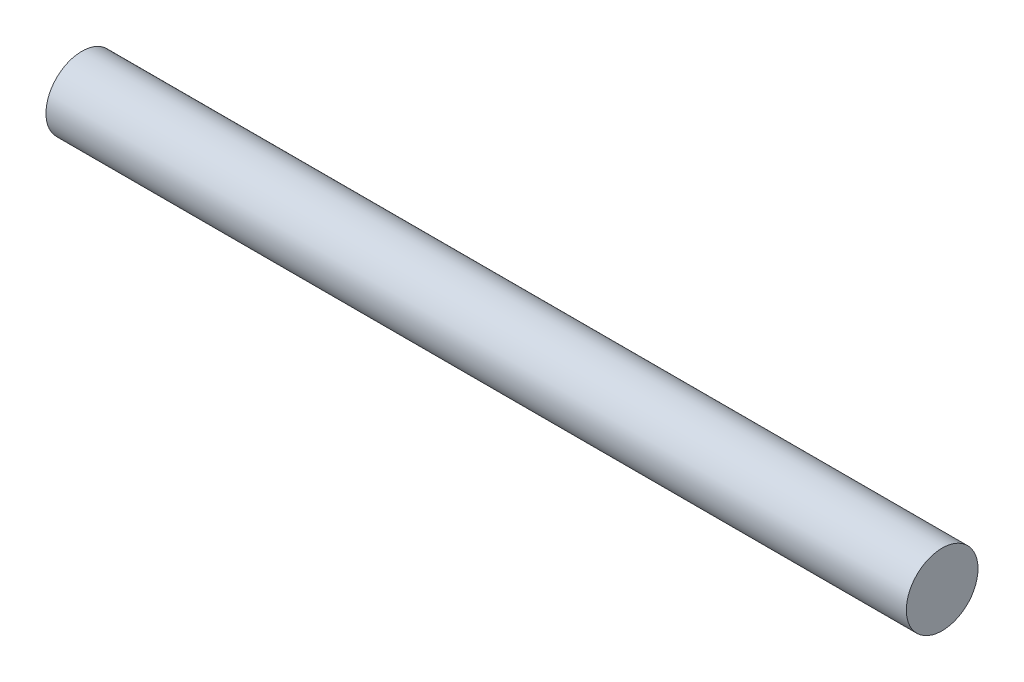
ISO-10303-21;
HEADER;
FILE_DESCRIPTION(('STEP AP214'),'2;1');
FILE_NAME('part.step','',(''),(''),'','','');
FILE_SCHEMA(('AUTOMOTIVE_DESIGN { 1 0 10303 214 1 1 1 1 }'));
ENDSEC;
DATA;
#1=APPLICATION_CONTEXT('core data for automotive mechanical design processes');
#2=APPLICATION_PROTOCOL_DEFINITION('international standard','automotive_design',2000,#1);
#3=PRODUCT_CONTEXT('',#1,'mechanical');
#4=PRODUCT('Part','Part','',(#3));
#5=PRODUCT_RELATED_PRODUCT_CATEGORY('part','',(#4));
#6=PRODUCT_DEFINITION_FORMATION('','',#4);
#7=PRODUCT_DEFINITION_CONTEXT('part definition',#1,'design');
#8=PRODUCT_DEFINITION('design','',#6,#7);
#9=PRODUCT_DEFINITION_SHAPE('','',#8);
#10=(LENGTH_UNIT() NAMED_UNIT(*) SI_UNIT(.MILLI.,.METRE.));
#11=(NAMED_UNIT(*) PLANE_ANGLE_UNIT() SI_UNIT($,.RADIAN.));
#12=(NAMED_UNIT(*) SI_UNIT($,.STERADIAN.) SOLID_ANGLE_UNIT());
#13=UNCERTAINTY_MEASURE_WITH_UNIT(LENGTH_MEASURE(1.E-05),#10,'distance_accuracy_value','');
#14=(GEOMETRIC_REPRESENTATION_CONTEXT(3) GLOBAL_UNCERTAINTY_ASSIGNED_CONTEXT((#13)) GLOBAL_UNIT_ASSIGNED_CONTEXT((#10,
#11,#12)) REPRESENTATION_CONTEXT('',''));
#15=CARTESIAN_POINT('',(0.,0.,0.));
#16=DIRECTION('',(0.,0.,1.));
#17=DIRECTION('',(1.,0.,0.));
#18=AXIS2_PLACEMENT_3D('',#15,#16,#17);
#19=CARTESIAN_POINT('',(120.,0.,0.));
#20=DIRECTION('',(-1.,0.,0.));
#21=DIRECTION('',(0.,0.,1.));
#22=AXIS2_PLACEMENT_3D('',#19,#20,#21);
#23=CYLINDRICAL_SURFACE('',#22,5.);
#24=CARTESIAN_POINT('',(120.,0.,0.));
#25=DIRECTION('',(1.,0.,0.));
#26=DIRECTION('',(0.,0.,-1.));
#27=AXIS2_PLACEMENT_3D('',#24,#25,#26);
#28=CIRCLE('',#27,5.);
#29=CARTESIAN_POINT('',(120.,0.,-5.));
#30=VERTEX_POINT('',#29);
#31=EDGE_CURVE('E10',#30,#30,#28,.T.);
#32=ORIENTED_EDGE('',*,*,#31,.F.);
#33=EDGE_LOOP('',(#32));
#34=FACE_BOUND('',#33,.T.);
#35=CARTESIAN_POINT('',(0.,0.,0.));
#36=DIRECTION('',(1.,0.,0.));
#37=DIRECTION('',(0.,0.,-1.));
#38=AXIS2_PLACEMENT_3D('',#35,#36,#37);
#39=CIRCLE('',#38,5.);
#40=CARTESIAN_POINT('',(0.,0.,-5.));
#41=VERTEX_POINT('',#40);
#42=EDGE_CURVE('E37',#41,#41,#39,.T.);
#43=ORIENTED_EDGE('',*,*,#42,.T.);
#44=EDGE_LOOP('',(#43));
#45=FACE_BOUND('',#44,.T.);
#46=ADVANCED_FACE('F34',(#34,#45),#23,.T.);
#47=CARTESIAN_POINT('',(120.,0.,0.));
#48=DIRECTION('',(1.,0.,0.));
#49=DIRECTION('',(0.,0.,-1.));
#50=AXIS2_PLACEMENT_3D('',#47,#48,#49);
#51=PLANE('',#50);
#52=ORIENTED_EDGE('',*,*,#31,.T.);
#53=EDGE_LOOP('',(#52));
#54=FACE_BOUND('',#53,.T.);
#55=ADVANCED_FACE('F49',(#54),#51,.T.);
#56=CARTESIAN_POINT('',(0.,0.,0.));
#57=DIRECTION('',(1.,0.,0.));
#58=DIRECTION('',(0.,0.,-1.));
#59=AXIS2_PLACEMENT_3D('',#56,#57,#58);
#60=PLANE('',#59);
#61=ORIENTED_EDGE('',*,*,#42,.F.);
#62=EDGE_LOOP('',(#61));
#63=FACE_BOUND('',#62,.T.);
#64=ADVANCED_FACE('F47',(#63),#60,.F.);
#65=CLOSED_SHELL('',(#46,#55,#64));
#66=MANIFOLD_SOLID_BREP('B2',#65);
#67=ADVANCED_BREP_SHAPE_REPRESENTATION('',(#18,#66),#14);
#68=SHAPE_DEFINITION_REPRESENTATION(#9,#67);
ENDSEC;
END-ISO-10303-21;
